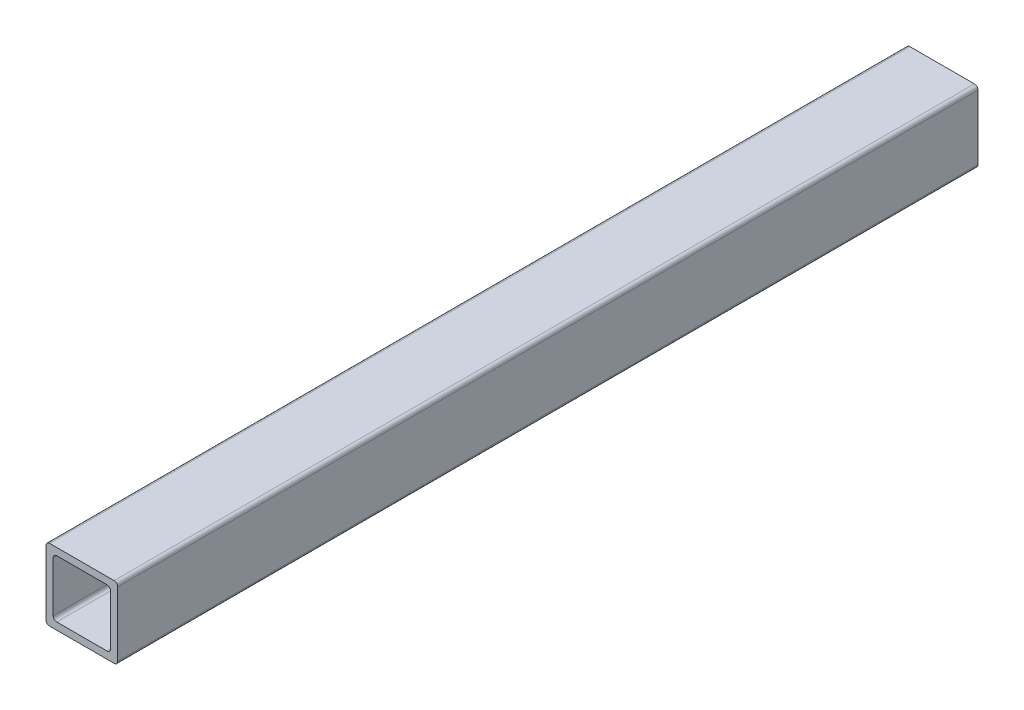
ISO-10303-21;
HEADER;
FILE_DESCRIPTION(('STEP AP214'),'2;1');
FILE_NAME('part.step','',(''),(''),'','','');
FILE_SCHEMA(('AUTOMOTIVE_DESIGN { 1 0 10303 214 1 1 1 1 }'));
ENDSEC;
DATA;
#1=APPLICATION_CONTEXT('core data for automotive mechanical design processes');
#2=APPLICATION_PROTOCOL_DEFINITION('international standard','automotive_design',2000,#1);
#3=PRODUCT_CONTEXT('',#1,'mechanical');
#4=PRODUCT('Part','Part','',(#3));
#5=PRODUCT_RELATED_PRODUCT_CATEGORY('part','',(#4));
#6=PRODUCT_DEFINITION_FORMATION('','',#4);
#7=PRODUCT_DEFINITION_CONTEXT('part definition',#1,'design');
#8=PRODUCT_DEFINITION('design','',#6,#7);
#9=PRODUCT_DEFINITION_SHAPE('','',#8);
#10=(LENGTH_UNIT() NAMED_UNIT(*) SI_UNIT(.MILLI.,.METRE.));
#11=(NAMED_UNIT(*) PLANE_ANGLE_UNIT() SI_UNIT($,.RADIAN.));
#12=(NAMED_UNIT(*) SI_UNIT($,.STERADIAN.) SOLID_ANGLE_UNIT());
#13=UNCERTAINTY_MEASURE_WITH_UNIT(LENGTH_MEASURE(1.E-05),#10,'distance_accuracy_value','');
#14=(GEOMETRIC_REPRESENTATION_CONTEXT(3) GLOBAL_UNCERTAINTY_ASSIGNED_CONTEXT((#13)) GLOBAL_UNIT_ASSIGNED_CONTEXT((#10,
#11,#12)) REPRESENTATION_CONTEXT('',''));
#15=CARTESIAN_POINT('',(0.,0.,0.));
#16=DIRECTION('',(0.,0.,1.));
#17=DIRECTION('',(1.,0.,0.));
#18=AXIS2_PLACEMENT_3D('',#15,#16,#17);
#19=CARTESIAN_POINT('',(2.,2.,480.));
#20=DIRECTION('',(0.,0.,-1.));
#21=DIRECTION('',(-1.,0.,0.));
#22=AXIS2_PLACEMENT_3D('',#19,#20,#21);
#23=PLANE('',#22);
#24=CARTESIAN_POINT('',(2.,2.,480.));
#25=DIRECTION('',(0.,0.,1.));
#26=DIRECTION('',(-1.,0.,0.));
#27=AXIS2_PLACEMENT_3D('',#24,#25,#26);
#28=CIRCLE('',#27,2.);
#29=CARTESIAN_POINT('',(0.,2.00000000000001,480.));
#30=VERTEX_POINT('',#29);
#31=CARTESIAN_POINT('',(2.00000000000001,0.,480.));
#32=VERTEX_POINT('',#31);
#33=EDGE_CURVE('E211',#30,#32,#28,.T.);
#34=ORIENTED_EDGE('',*,*,#33,.T.);
#35=DIRECTION('',(1.,0.,0.));
#36=VECTOR('',#35,1.);
#37=CARTESIAN_POINT('',(2.00000000000001,0.,480.));
#38=LINE('',#37,#36);
#39=CARTESIAN_POINT('',(38.,0.,480.));
#40=VERTEX_POINT('',#39);
#41=EDGE_CURVE('E214',#32,#40,#38,.T.);
#42=ORIENTED_EDGE('',*,*,#41,.T.);
#43=CARTESIAN_POINT('',(38.,2.,480.));
#44=DIRECTION('',(0.,0.,1.));
#45=DIRECTION('',(-1.,0.,0.));
#46=AXIS2_PLACEMENT_3D('',#43,#44,#45);
#47=CIRCLE('',#46,2.);
#48=CARTESIAN_POINT('',(40.,2.00000000000001,480.));
#49=VERTEX_POINT('',#48);
#50=EDGE_CURVE('E217',#40,#49,#47,.T.);
#51=ORIENTED_EDGE('',*,*,#50,.T.);
#52=DIRECTION('',(0.,1.,0.));
#53=VECTOR('',#52,1.);
#54=CARTESIAN_POINT('',(40.,2.00000000000001,480.));
#55=LINE('',#54,#53);
#56=CARTESIAN_POINT('',(40.,38.,480.));
#57=VERTEX_POINT('',#56);
#58=EDGE_CURVE('E219',#49,#57,#55,.T.);
#59=ORIENTED_EDGE('',*,*,#58,.T.);
#60=CARTESIAN_POINT('',(38.,38.,480.));
#61=DIRECTION('',(0.,0.,1.));
#62=DIRECTION('',(-1.,0.,0.));
#63=AXIS2_PLACEMENT_3D('',#60,#61,#62);
#64=CIRCLE('',#63,2.);
#65=CARTESIAN_POINT('',(38.,40.,480.));
#66=VERTEX_POINT('',#65);
#67=EDGE_CURVE('E221',#57,#66,#64,.T.);
#68=ORIENTED_EDGE('',*,*,#67,.T.);
#69=DIRECTION('',(-1.,0.,0.));
#70=VECTOR('',#69,1.);
#71=CARTESIAN_POINT('',(2.00000000000001,40.,480.));
#72=LINE('',#71,#70);
#73=CARTESIAN_POINT('',(2.00000000000001,40.,480.));
#74=VERTEX_POINT('',#73);
#75=EDGE_CURVE('E223',#66,#74,#72,.T.);
#76=ORIENTED_EDGE('',*,*,#75,.T.);
#77=CARTESIAN_POINT('',(2.,38.,480.));
#78=DIRECTION('',(0.,0.,1.));
#79=DIRECTION('',(-1.,0.,0.));
#80=AXIS2_PLACEMENT_3D('',#77,#78,#79);
#81=CIRCLE('',#80,2.);
#82=CARTESIAN_POINT('',(0.,38.,480.));
#83=VERTEX_POINT('',#82);
#84=EDGE_CURVE('E225',#74,#83,#81,.T.);
#85=ORIENTED_EDGE('',*,*,#84,.T.);
#86=DIRECTION('',(0.,-1.,0.));
#87=VECTOR('',#86,1.);
#88=CARTESIAN_POINT('',(0.,2.00000000000001,480.));
#89=LINE('',#88,#87);
#90=EDGE_CURVE('E227',#83,#30,#89,.T.);
#91=ORIENTED_EDGE('',*,*,#90,.T.);
#92=EDGE_LOOP('',(#34,#42,#51,#59,#68,#76,#85,#91));
#93=FACE_BOUND('',#92,.T.);
#94=CARTESIAN_POINT('',(34.,6.,480.));
#95=DIRECTION('',(0.,0.,1.));
#96=DIRECTION('',(1.,0.,0.));
#97=AXIS2_PLACEMENT_3D('',#94,#95,#96);
#98=CIRCLE('',#97,2.);
#99=CARTESIAN_POINT('',(34.,4.,480.));
#100=VERTEX_POINT('',#99);
#101=CARTESIAN_POINT('',(36.,6.00000000000001,480.));
#102=VERTEX_POINT('',#101);
#103=EDGE_CURVE('E146',#100,#102,#98,.T.);
#104=ORIENTED_EDGE('',*,*,#103,.F.);
#105=DIRECTION('',(1.,0.,0.));
#106=VECTOR('',#105,1.);
#107=CARTESIAN_POINT('',(6.00000000000001,4.,480.));
#108=LINE('',#107,#106);
#109=CARTESIAN_POINT('',(6.00000000000001,4.,480.));
#110=VERTEX_POINT('',#109);
#111=EDGE_CURVE('E179',#110,#100,#108,.T.);
#112=ORIENTED_EDGE('',*,*,#111,.F.);
#113=CARTESIAN_POINT('',(6.,6.,480.));
#114=DIRECTION('',(0.,0.,1.));
#115=DIRECTION('',(1.,0.,0.));
#116=AXIS2_PLACEMENT_3D('',#113,#114,#115);
#117=CIRCLE('',#116,2.);
#118=CARTESIAN_POINT('',(4.,6.00000000000001,480.));
#119=VERTEX_POINT('',#118);
#120=EDGE_CURVE('E177',#119,#110,#117,.T.);
#121=ORIENTED_EDGE('',*,*,#120,.F.);
#122=DIRECTION('',(0.,-1.,0.));
#123=VECTOR('',#122,1.);
#124=CARTESIAN_POINT('',(4.,6.00000000000001,480.));
#125=LINE('',#124,#123);
#126=CARTESIAN_POINT('',(4.,34.,480.));
#127=VERTEX_POINT('',#126);
#128=EDGE_CURVE('E175',#127,#119,#125,.T.);
#129=ORIENTED_EDGE('',*,*,#128,.F.);
#130=CARTESIAN_POINT('',(6.,34.,480.));
#131=DIRECTION('',(0.,0.,1.));
#132=DIRECTION('',(1.,0.,0.));
#133=AXIS2_PLACEMENT_3D('',#130,#131,#132);
#134=CIRCLE('',#133,2.);
#135=CARTESIAN_POINT('',(6.00000000000001,36.,480.));
#136=VERTEX_POINT('',#135);
#137=EDGE_CURVE('E173',#136,#127,#134,.T.);
#138=ORIENTED_EDGE('',*,*,#137,.F.);
#139=DIRECTION('',(-1.,0.,0.));
#140=VECTOR('',#139,1.);
#141=CARTESIAN_POINT('',(6.00000000000001,36.,480.));
#142=LINE('',#141,#140);
#143=CARTESIAN_POINT('',(34.,36.,480.));
#144=VERTEX_POINT('',#143);
#145=EDGE_CURVE('E169',#144,#136,#142,.T.);
#146=ORIENTED_EDGE('',*,*,#145,.F.);
#147=CARTESIAN_POINT('',(34.,34.,480.));
#148=DIRECTION('',(0.,0.,1.));
#149=DIRECTION('',(1.,0.,0.));
#150=AXIS2_PLACEMENT_3D('',#147,#148,#149);
#151=CIRCLE('',#150,2.);
#152=CARTESIAN_POINT('',(36.,34.,480.));
#153=VERTEX_POINT('',#152);
#154=EDGE_CURVE('E167',#153,#144,#151,.T.);
#155=ORIENTED_EDGE('',*,*,#154,.F.);
#156=DIRECTION('',(0.,1.,0.));
#157=VECTOR('',#156,1.);
#158=CARTESIAN_POINT('',(36.,6.00000000000001,480.));
#159=LINE('',#158,#157);
#160=EDGE_CURVE('E154',#102,#153,#159,.T.);
#161=ORIENTED_EDGE('',*,*,#160,.F.);
#162=EDGE_LOOP('',(#104,#112,#121,#129,#138,#146,#155,#161));
#163=FACE_BOUND('',#162,.T.);
#164=ADVANCED_FACE('F33',(#93,#163),#23,.F.);
#165=CARTESIAN_POINT('',(2.,2.,0.));
#166=DIRECTION('',(0.,0.,-1.));
#167=DIRECTION('',(-1.,0.,0.));
#168=AXIS2_PLACEMENT_3D('',#165,#166,#167);
#169=PLANE('',#168);
#170=CARTESIAN_POINT('',(2.,2.,0.));
#171=DIRECTION('',(0.,0.,1.));
#172=DIRECTION('',(-1.,0.,0.));
#173=AXIS2_PLACEMENT_3D('',#170,#171,#172);
#174=CIRCLE('',#173,2.);
#175=CARTESIAN_POINT('',(0.,2.00000000000001,0.));
#176=VERTEX_POINT('',#175);
#177=CARTESIAN_POINT('',(2.00000000000001,0.,0.));
#178=VERTEX_POINT('',#177);
#179=EDGE_CURVE('E162',#176,#178,#174,.T.);
#180=ORIENTED_EDGE('',*,*,#179,.F.);
#181=DIRECTION('',(0.,-1.,0.));
#182=VECTOR('',#181,1.);
#183=CARTESIAN_POINT('',(0.,2.00000000000001,0.));
#184=LINE('',#183,#182);
#185=CARTESIAN_POINT('',(0.,38.,0.));
#186=VERTEX_POINT('',#185);
#187=EDGE_CURVE('E215',#186,#176,#184,.T.);
#188=ORIENTED_EDGE('',*,*,#187,.F.);
#189=CARTESIAN_POINT('',(2.,38.,0.));
#190=DIRECTION('',(0.,0.,1.));
#191=DIRECTION('',(-1.,0.,0.));
#192=AXIS2_PLACEMENT_3D('',#189,#190,#191);
#193=CIRCLE('',#192,2.);
#194=CARTESIAN_POINT('',(2.00000000000001,40.,0.));
#195=VERTEX_POINT('',#194);
#196=EDGE_CURVE('E242',#195,#186,#193,.T.);
#197=ORIENTED_EDGE('',*,*,#196,.F.);
#198=DIRECTION('',(-1.,0.,0.));
#199=VECTOR('',#198,1.);
#200=CARTESIAN_POINT('',(2.00000000000001,40.,0.));
#201=LINE('',#200,#199);
#202=CARTESIAN_POINT('',(38.,40.,0.));
#203=VERTEX_POINT('',#202);
#204=EDGE_CURVE('E240',#203,#195,#201,.T.);
#205=ORIENTED_EDGE('',*,*,#204,.F.);
#206=CARTESIAN_POINT('',(38.,38.,0.));
#207=DIRECTION('',(0.,0.,1.));
#208=DIRECTION('',(-1.,0.,0.));
#209=AXIS2_PLACEMENT_3D('',#206,#207,#208);
#210=CIRCLE('',#209,2.);
#211=CARTESIAN_POINT('',(40.,38.,0.));
#212=VERTEX_POINT('',#211);
#213=EDGE_CURVE('E238',#212,#203,#210,.T.);
#214=ORIENTED_EDGE('',*,*,#213,.F.);
#215=DIRECTION('',(0.,1.,0.));
#216=VECTOR('',#215,1.);
#217=CARTESIAN_POINT('',(40.,2.00000000000001,0.));
#218=LINE('',#217,#216);
#219=CARTESIAN_POINT('',(40.,2.00000000000001,0.));
#220=VERTEX_POINT('',#219);
#221=EDGE_CURVE('E236',#220,#212,#218,.T.);
#222=ORIENTED_EDGE('',*,*,#221,.F.);
#223=CARTESIAN_POINT('',(38.,2.,0.));
#224=DIRECTION('',(0.,0.,1.));
#225=DIRECTION('',(-1.,0.,0.));
#226=AXIS2_PLACEMENT_3D('',#223,#224,#225);
#227=CIRCLE('',#226,2.);
#228=CARTESIAN_POINT('',(38.,0.,0.));
#229=VERTEX_POINT('',#228);
#230=EDGE_CURVE('E234',#229,#220,#227,.T.);
#231=ORIENTED_EDGE('',*,*,#230,.F.);
#232=DIRECTION('',(1.,0.,0.));
#233=VECTOR('',#232,1.);
#234=CARTESIAN_POINT('',(2.00000000000001,0.,0.));
#235=LINE('',#234,#233);
#236=EDGE_CURVE('E232',#178,#229,#235,.T.);
#237=ORIENTED_EDGE('',*,*,#236,.F.);
#238=EDGE_LOOP('',(#180,#188,#197,#205,#214,#222,#231,#237));
#239=FACE_BOUND('',#238,.T.);
#240=DIRECTION('',(1.,0.,0.));
#241=VECTOR('',#240,1.);
#242=CARTESIAN_POINT('',(6.00000000000001,4.,0.));
#243=LINE('',#242,#241);
#244=CARTESIAN_POINT('',(6.00000000000001,4.,0.));
#245=VERTEX_POINT('',#244);
#246=CARTESIAN_POINT('',(34.,4.,0.));
#247=VERTEX_POINT('',#246);
#248=EDGE_CURVE('E155',#245,#247,#243,.T.);
#249=ORIENTED_EDGE('',*,*,#248,.T.);
#250=CARTESIAN_POINT('',(34.,6.,0.));
#251=DIRECTION('',(0.,0.,1.));
#252=DIRECTION('',(1.,0.,0.));
#253=AXIS2_PLACEMENT_3D('',#250,#251,#252);
#254=CIRCLE('',#253,2.);
#255=CARTESIAN_POINT('',(36.,6.00000000000001,0.));
#256=VERTEX_POINT('',#255);
#257=EDGE_CURVE('E56',#247,#256,#254,.T.);
#258=ORIENTED_EDGE('',*,*,#257,.T.);
#259=DIRECTION('',(0.,1.,0.));
#260=VECTOR('',#259,1.);
#261=CARTESIAN_POINT('',(36.,6.00000000000001,0.));
#262=LINE('',#261,#260);
#263=CARTESIAN_POINT('',(36.,34.,0.));
#264=VERTEX_POINT('',#263);
#265=EDGE_CURVE('E161',#256,#264,#262,.T.);
#266=ORIENTED_EDGE('',*,*,#265,.T.);
#267=CARTESIAN_POINT('',(34.,34.,0.));
#268=DIRECTION('',(0.,0.,1.));
#269=DIRECTION('',(1.,0.,0.));
#270=AXIS2_PLACEMENT_3D('',#267,#268,#269);
#271=CIRCLE('',#270,2.);
#272=CARTESIAN_POINT('',(34.,36.,0.));
#273=VERTEX_POINT('',#272);
#274=EDGE_CURVE('E183',#264,#273,#271,.T.);
#275=ORIENTED_EDGE('',*,*,#274,.T.);
#276=DIRECTION('',(-1.,0.,0.));
#277=VECTOR('',#276,1.);
#278=CARTESIAN_POINT('',(6.00000000000001,36.,0.));
#279=LINE('',#278,#277);
#280=CARTESIAN_POINT('',(6.00000000000001,36.,0.));
#281=VERTEX_POINT('',#280);
#282=EDGE_CURVE('E186',#273,#281,#279,.T.);
#283=ORIENTED_EDGE('',*,*,#282,.T.);
#284=CARTESIAN_POINT('',(6.,34.,0.));
#285=DIRECTION('',(0.,0.,1.));
#286=DIRECTION('',(1.,0.,0.));
#287=AXIS2_PLACEMENT_3D('',#284,#285,#286);
#288=CIRCLE('',#287,2.);
#289=CARTESIAN_POINT('',(4.,34.,0.));
#290=VERTEX_POINT('',#289);
#291=EDGE_CURVE('E189',#281,#290,#288,.T.);
#292=ORIENTED_EDGE('',*,*,#291,.T.);
#293=DIRECTION('',(0.,-1.,0.));
#294=VECTOR('',#293,1.);
#295=CARTESIAN_POINT('',(4.,6.00000000000001,0.));
#296=LINE('',#295,#294);
#297=CARTESIAN_POINT('',(4.,6.00000000000001,0.));
#298=VERTEX_POINT('',#297);
#299=EDGE_CURVE('E192',#290,#298,#296,.T.);
#300=ORIENTED_EDGE('',*,*,#299,.T.);
#301=CARTESIAN_POINT('',(6.,6.,0.));
#302=DIRECTION('',(0.,0.,1.));
#303=DIRECTION('',(1.,0.,0.));
#304=AXIS2_PLACEMENT_3D('',#301,#302,#303);
#305=CIRCLE('',#304,2.);
#306=EDGE_CURVE('E195',#298,#245,#305,.T.);
#307=ORIENTED_EDGE('',*,*,#306,.T.);
#308=EDGE_LOOP('',(#249,#258,#266,#275,#283,#292,#300,#307));
#309=FACE_BOUND('',#308,.T.);
#310=ADVANCED_FACE('F272',(#239,#309),#169,.T.);
#311=CARTESIAN_POINT('',(2.,2.,480.));
#312=DIRECTION('',(0.,0.,-1.));
#313=DIRECTION('',(-1.,0.,0.));
#314=AXIS2_PLACEMENT_3D('',#311,#312,#313);
#315=CYLINDRICAL_SURFACE('',#314,2.);
#316=ORIENTED_EDGE('',*,*,#179,.T.);
#317=DIRECTION('',(0.,0.,-1.));
#318=VECTOR('',#317,1.);
#319=CARTESIAN_POINT('',(2.00000000000001,0.,480.));
#320=LINE('',#319,#318);
#321=EDGE_CURVE('E11',#32,#178,#320,.T.);
#322=ORIENTED_EDGE('',*,*,#321,.F.);
#323=ORIENTED_EDGE('',*,*,#33,.F.);
#324=DIRECTION('',(0.,0.,-1.));
#325=VECTOR('',#324,1.);
#326=CARTESIAN_POINT('',(0.,2.00000000000001,480.));
#327=LINE('',#326,#325);
#328=EDGE_CURVE('E229',#30,#176,#327,.T.);
#329=ORIENTED_EDGE('',*,*,#328,.T.);
#330=EDGE_LOOP('',(#316,#322,#323,#329));
#331=FACE_BOUND('',#330,.T.);
#332=ADVANCED_FACE('F35',(#331),#315,.T.);
#333=CARTESIAN_POINT('',(2.00000000000001,0.,480.));
#334=DIRECTION('',(0.,1.,0.));
#335=DIRECTION('',(0.,0.,1.));
#336=AXIS2_PLACEMENT_3D('',#333,#334,#335);
#337=PLANE('',#336);
#338=ORIENTED_EDGE('',*,*,#236,.T.);
#339=DIRECTION('',(0.,0.,-1.));
#340=VECTOR('',#339,1.);
#341=CARTESIAN_POINT('',(38.,0.,480.));
#342=LINE('',#341,#340);
#343=EDGE_CURVE('E41',#40,#229,#342,.T.);
#344=ORIENTED_EDGE('',*,*,#343,.F.);
#345=ORIENTED_EDGE('',*,*,#41,.F.);
#346=ORIENTED_EDGE('',*,*,#321,.T.);
#347=EDGE_LOOP('',(#338,#344,#345,#346));
#348=FACE_BOUND('',#347,.T.);
#349=ADVANCED_FACE('F289',(#348),#337,.F.);
#350=CARTESIAN_POINT('',(38.,2.,480.));
#351=DIRECTION('',(0.,0.,-1.));
#352=DIRECTION('',(-1.,0.,0.));
#353=AXIS2_PLACEMENT_3D('',#350,#351,#352);
#354=CYLINDRICAL_SURFACE('',#353,2.);
#355=ORIENTED_EDGE('',*,*,#230,.T.);
#356=DIRECTION('',(0.,0.,-1.));
#357=VECTOR('',#356,1.);
#358=CARTESIAN_POINT('',(40.,2.00000000000001,480.));
#359=LINE('',#358,#357);
#360=EDGE_CURVE('E259',#49,#220,#359,.T.);
#361=ORIENTED_EDGE('',*,*,#360,.F.);
#362=ORIENTED_EDGE('',*,*,#50,.F.);
#363=ORIENTED_EDGE('',*,*,#343,.T.);
#364=EDGE_LOOP('',(#355,#361,#362,#363));
#365=FACE_BOUND('',#364,.T.);
#366=ADVANCED_FACE('F266',(#365),#354,.T.);
#367=CARTESIAN_POINT('',(40.,2.00000000000001,480.));
#368=DIRECTION('',(-1.,0.,0.));
#369=DIRECTION('',(0.,0.,1.));
#370=AXIS2_PLACEMENT_3D('',#367,#368,#369);
#371=PLANE('',#370);
#372=ORIENTED_EDGE('',*,*,#221,.T.);
#373=DIRECTION('',(0.,0.,-1.));
#374=VECTOR('',#373,1.);
#375=CARTESIAN_POINT('',(40.,38.,480.));
#376=LINE('',#375,#374);
#377=EDGE_CURVE('E256',#57,#212,#376,.T.);
#378=ORIENTED_EDGE('',*,*,#377,.F.);
#379=ORIENTED_EDGE('',*,*,#58,.F.);
#380=ORIENTED_EDGE('',*,*,#360,.T.);
#381=EDGE_LOOP('',(#372,#378,#379,#380));
#382=FACE_BOUND('',#381,.T.);
#383=ADVANCED_FACE('F278',(#382),#371,.F.);
#384=CARTESIAN_POINT('',(38.,38.,480.));
#385=DIRECTION('',(0.,0.,-1.));
#386=DIRECTION('',(-1.,0.,0.));
#387=AXIS2_PLACEMENT_3D('',#384,#385,#386);
#388=CYLINDRICAL_SURFACE('',#387,2.);
#389=ORIENTED_EDGE('',*,*,#213,.T.);
#390=DIRECTION('',(0.,0.,-1.));
#391=VECTOR('',#390,1.);
#392=CARTESIAN_POINT('',(38.,40.,480.));
#393=LINE('',#392,#391);
#394=EDGE_CURVE('E253',#66,#203,#393,.T.);
#395=ORIENTED_EDGE('',*,*,#394,.F.);
#396=ORIENTED_EDGE('',*,*,#67,.F.);
#397=ORIENTED_EDGE('',*,*,#377,.T.);
#398=EDGE_LOOP('',(#389,#395,#396,#397));
#399=FACE_BOUND('',#398,.T.);
#400=ADVANCED_FACE('F282',(#399),#388,.T.);
#401=CARTESIAN_POINT('',(2.00000000000001,40.,480.));
#402=DIRECTION('',(0.,-1.,0.));
#403=DIRECTION('',(0.,0.,-1.));
#404=AXIS2_PLACEMENT_3D('',#401,#402,#403);
#405=PLANE('',#404);
#406=ORIENTED_EDGE('',*,*,#204,.T.);
#407=DIRECTION('',(0.,0.,-1.));
#408=VECTOR('',#407,1.);
#409=CARTESIAN_POINT('',(2.00000000000001,40.,480.));
#410=LINE('',#409,#408);
#411=EDGE_CURVE('E250',#74,#195,#410,.T.);
#412=ORIENTED_EDGE('',*,*,#411,.F.);
#413=ORIENTED_EDGE('',*,*,#75,.F.);
#414=ORIENTED_EDGE('',*,*,#394,.T.);
#415=EDGE_LOOP('',(#406,#412,#413,#414));
#416=FACE_BOUND('',#415,.T.);
#417=ADVANCED_FACE('F302',(#416),#405,.F.);
#418=CARTESIAN_POINT('',(2.,38.,480.));
#419=DIRECTION('',(0.,0.,-1.));
#420=DIRECTION('',(-1.,0.,0.));
#421=AXIS2_PLACEMENT_3D('',#418,#419,#420);
#422=CYLINDRICAL_SURFACE('',#421,2.);
#423=ORIENTED_EDGE('',*,*,#196,.T.);
#424=DIRECTION('',(0.,0.,-1.));
#425=VECTOR('',#424,1.);
#426=CARTESIAN_POINT('',(0.,38.,480.));
#427=LINE('',#426,#425);
#428=EDGE_CURVE('E247',#83,#186,#427,.T.);
#429=ORIENTED_EDGE('',*,*,#428,.F.);
#430=ORIENTED_EDGE('',*,*,#84,.F.);
#431=ORIENTED_EDGE('',*,*,#411,.T.);
#432=EDGE_LOOP('',(#423,#429,#430,#431));
#433=FACE_BOUND('',#432,.T.);
#434=ADVANCED_FACE('F300',(#433),#422,.T.);
#435=CARTESIAN_POINT('',(0.,2.00000000000001,480.));
#436=DIRECTION('',(1.,0.,0.));
#437=DIRECTION('',(0.,0.,-1.));
#438=AXIS2_PLACEMENT_3D('',#435,#436,#437);
#439=PLANE('',#438);
#440=ORIENTED_EDGE('',*,*,#187,.T.);
#441=ORIENTED_EDGE('',*,*,#328,.F.);
#442=ORIENTED_EDGE('',*,*,#90,.F.);
#443=ORIENTED_EDGE('',*,*,#428,.T.);
#444=EDGE_LOOP('',(#440,#441,#442,#443));
#445=FACE_BOUND('',#444,.T.);
#446=ADVANCED_FACE('F295',(#445),#439,.F.);
#447=CARTESIAN_POINT('',(34.,6.,480.));
#448=DIRECTION('',(0.,0.,-1.));
#449=DIRECTION('',(-1.,0.,0.));
#450=AXIS2_PLACEMENT_3D('',#447,#448,#449);
#451=CYLINDRICAL_SURFACE('',#450,2.);
#452=ORIENTED_EDGE('',*,*,#257,.F.);
#453=DIRECTION('',(0.,0.,-1.));
#454=VECTOR('',#453,1.);
#455=CARTESIAN_POINT('',(34.,4.,480.));
#456=LINE('',#455,#454);
#457=EDGE_CURVE('E150',#100,#247,#456,.T.);
#458=ORIENTED_EDGE('',*,*,#457,.F.);
#459=ORIENTED_EDGE('',*,*,#103,.T.);
#460=DIRECTION('',(0.,0.,-1.));
#461=VECTOR('',#460,1.);
#462=CARTESIAN_POINT('',(36.,6.00000000000001,480.));
#463=LINE('',#462,#461);
#464=EDGE_CURVE('E149',#102,#256,#463,.T.);
#465=ORIENTED_EDGE('',*,*,#464,.T.);
#466=EDGE_LOOP('',(#452,#458,#459,#465));
#467=FACE_BOUND('',#466,.T.);
#468=ADVANCED_FACE('F148',(#467),#451,.F.);
#469=CARTESIAN_POINT('',(36.,6.00000000000001,480.));
#470=DIRECTION('',(-1.,0.,0.));
#471=DIRECTION('',(0.,0.,1.));
#472=AXIS2_PLACEMENT_3D('',#469,#470,#471);
#473=PLANE('',#472);
#474=ORIENTED_EDGE('',*,*,#265,.F.);
#475=ORIENTED_EDGE('',*,*,#464,.F.);
#476=ORIENTED_EDGE('',*,*,#160,.T.);
#477=DIRECTION('',(0.,0.,-1.));
#478=VECTOR('',#477,1.);
#479=CARTESIAN_POINT('',(36.,34.,480.));
#480=LINE('',#479,#478);
#481=EDGE_CURVE('E163',#153,#264,#480,.T.);
#482=ORIENTED_EDGE('',*,*,#481,.T.);
#483=EDGE_LOOP('',(#474,#475,#476,#482));
#484=FACE_BOUND('',#483,.T.);
#485=ADVANCED_FACE('F158',(#484),#473,.T.);
#486=CARTESIAN_POINT('',(34.,34.,480.));
#487=DIRECTION('',(0.,0.,-1.));
#488=DIRECTION('',(-1.,0.,0.));
#489=AXIS2_PLACEMENT_3D('',#486,#487,#488);
#490=CYLINDRICAL_SURFACE('',#489,2.);
#491=ORIENTED_EDGE('',*,*,#274,.F.);
#492=ORIENTED_EDGE('',*,*,#481,.F.);
#493=ORIENTED_EDGE('',*,*,#154,.T.);
#494=DIRECTION('',(0.,0.,-1.));
#495=VECTOR('',#494,1.);
#496=CARTESIAN_POINT('',(34.,36.,480.));
#497=LINE('',#496,#495);
#498=EDGE_CURVE('E208',#144,#273,#497,.T.);
#499=ORIENTED_EDGE('',*,*,#498,.T.);
#500=EDGE_LOOP('',(#491,#492,#493,#499));
#501=FACE_BOUND('',#500,.T.);
#502=ADVANCED_FACE('F327',(#501),#490,.F.);
#503=CARTESIAN_POINT('',(6.00000000000001,36.,480.));
#504=DIRECTION('',(0.,-1.,0.));
#505=DIRECTION('',(0.,0.,-1.));
#506=AXIS2_PLACEMENT_3D('',#503,#504,#505);
#507=PLANE('',#506);
#508=ORIENTED_EDGE('',*,*,#282,.F.);
#509=ORIENTED_EDGE('',*,*,#498,.F.);
#510=ORIENTED_EDGE('',*,*,#145,.T.);
#511=DIRECTION('',(0.,0.,-1.));
#512=VECTOR('',#511,1.);
#513=CARTESIAN_POINT('',(6.00000000000001,36.,480.));
#514=LINE('',#513,#512);
#515=EDGE_CURVE('E206',#136,#281,#514,.T.);
#516=ORIENTED_EDGE('',*,*,#515,.T.);
#517=EDGE_LOOP('',(#508,#509,#510,#516));
#518=FACE_BOUND('',#517,.T.);
#519=ADVANCED_FACE('F331',(#518),#507,.T.);
#520=CARTESIAN_POINT('',(6.,34.,480.));
#521=DIRECTION('',(0.,0.,-1.));
#522=DIRECTION('',(-1.,0.,0.));
#523=AXIS2_PLACEMENT_3D('',#520,#521,#522);
#524=CYLINDRICAL_SURFACE('',#523,2.);
#525=ORIENTED_EDGE('',*,*,#291,.F.);
#526=ORIENTED_EDGE('',*,*,#515,.F.);
#527=ORIENTED_EDGE('',*,*,#137,.T.);
#528=DIRECTION('',(0.,0.,-1.));
#529=VECTOR('',#528,1.);
#530=CARTESIAN_POINT('',(4.,34.,480.));
#531=LINE('',#530,#529);
#532=EDGE_CURVE('E204',#127,#290,#531,.T.);
#533=ORIENTED_EDGE('',*,*,#532,.T.);
#534=EDGE_LOOP('',(#525,#526,#527,#533));
#535=FACE_BOUND('',#534,.T.);
#536=ADVANCED_FACE('F337',(#535),#524,.F.);
#537=CARTESIAN_POINT('',(4.,6.00000000000001,480.));
#538=DIRECTION('',(1.,0.,0.));
#539=DIRECTION('',(0.,0.,-1.));
#540=AXIS2_PLACEMENT_3D('',#537,#538,#539);
#541=PLANE('',#540);
#542=ORIENTED_EDGE('',*,*,#299,.F.);
#543=ORIENTED_EDGE('',*,*,#532,.F.);
#544=ORIENTED_EDGE('',*,*,#128,.T.);
#545=DIRECTION('',(0.,0.,-1.));
#546=VECTOR('',#545,1.);
#547=CARTESIAN_POINT('',(4.,6.00000000000001,480.));
#548=LINE('',#547,#546);
#549=EDGE_CURVE('E202',#119,#298,#548,.T.);
#550=ORIENTED_EDGE('',*,*,#549,.T.);
#551=EDGE_LOOP('',(#542,#543,#544,#550));
#552=FACE_BOUND('',#551,.T.);
#553=ADVANCED_FACE('F341',(#552),#541,.T.);
#554=CARTESIAN_POINT('',(6.,6.,480.));
#555=DIRECTION('',(0.,0.,-1.));
#556=DIRECTION('',(-1.,0.,0.));
#557=AXIS2_PLACEMENT_3D('',#554,#555,#556);
#558=CYLINDRICAL_SURFACE('',#557,2.);
#559=ORIENTED_EDGE('',*,*,#306,.F.);
#560=ORIENTED_EDGE('',*,*,#549,.F.);
#561=ORIENTED_EDGE('',*,*,#120,.T.);
#562=DIRECTION('',(0.,0.,-1.));
#563=VECTOR('',#562,1.);
#564=CARTESIAN_POINT('',(6.00000000000001,4.,480.));
#565=LINE('',#564,#563);
#566=EDGE_CURVE('E48',#110,#245,#565,.T.);
#567=ORIENTED_EDGE('',*,*,#566,.T.);
#568=EDGE_LOOP('',(#559,#560,#561,#567));
#569=FACE_BOUND('',#568,.T.);
#570=ADVANCED_FACE('F345',(#569),#558,.F.);
#571=CARTESIAN_POINT('',(6.00000000000001,4.,480.));
#572=DIRECTION('',(0.,1.,0.));
#573=DIRECTION('',(0.,0.,1.));
#574=AXIS2_PLACEMENT_3D('',#571,#572,#573);
#575=PLANE('',#574);
#576=ORIENTED_EDGE('',*,*,#248,.F.);
#577=ORIENTED_EDGE('',*,*,#566,.F.);
#578=ORIENTED_EDGE('',*,*,#111,.T.);
#579=ORIENTED_EDGE('',*,*,#457,.T.);
#580=EDGE_LOOP('',(#576,#577,#578,#579));
#581=FACE_BOUND('',#580,.T.);
#582=ADVANCED_FACE('F349',(#581),#575,.T.);
#583=CLOSED_SHELL('',(#164,#310,#332,#349,#366,#383,#400,#417,#434,#446,#468,#485,#502,#519,
#536,#553,#570,#582));
#584=MANIFOLD_SOLID_BREP('B2',#583);
#585=ADVANCED_BREP_SHAPE_REPRESENTATION('',(#18,#584),#14);
#586=SHAPE_DEFINITION_REPRESENTATION(#9,#585);
ENDSEC;
END-ISO-10303-21;
